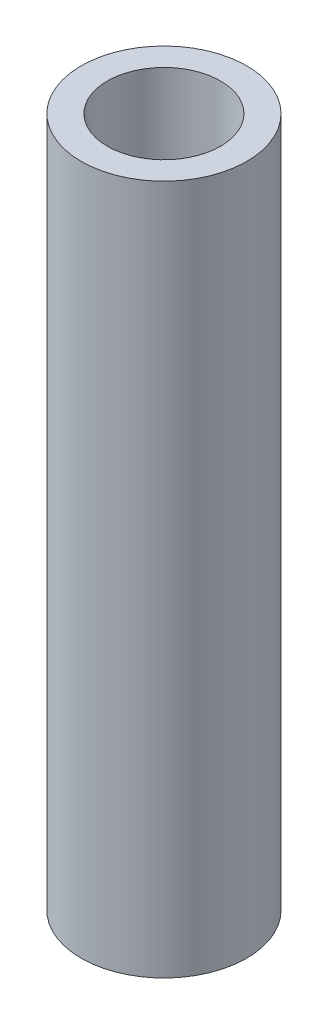
ISO-10303-21;
HEADER;
FILE_DESCRIPTION(('STEP AP214'),'2;1');
FILE_NAME('part.step','',(''),(''),'','','');
FILE_SCHEMA(('AUTOMOTIVE_DESIGN { 1 0 10303 214 1 1 1 1 }'));
ENDSEC;
DATA;
#1=APPLICATION_CONTEXT('core data for automotive mechanical design processes');
#2=APPLICATION_PROTOCOL_DEFINITION('international standard','automotive_design',2000,#1);
#3=PRODUCT_CONTEXT('',#1,'mechanical');
#4=PRODUCT('Part','Part','',(#3));
#5=PRODUCT_RELATED_PRODUCT_CATEGORY('part','',(#4));
#6=PRODUCT_DEFINITION_FORMATION('','',#4);
#7=PRODUCT_DEFINITION_CONTEXT('part definition',#1,'design');
#8=PRODUCT_DEFINITION('design','',#6,#7);
#9=PRODUCT_DEFINITION_SHAPE('','',#8);
#10=(LENGTH_UNIT() NAMED_UNIT(*) SI_UNIT(.MILLI.,.METRE.));
#11=(NAMED_UNIT(*) PLANE_ANGLE_UNIT() SI_UNIT($,.RADIAN.));
#12=(NAMED_UNIT(*) SI_UNIT($,.STERADIAN.) SOLID_ANGLE_UNIT());
#13=UNCERTAINTY_MEASURE_WITH_UNIT(LENGTH_MEASURE(1.E-05),#10,'distance_accuracy_value','');
#14=(GEOMETRIC_REPRESENTATION_CONTEXT(3) GLOBAL_UNCERTAINTY_ASSIGNED_CONTEXT((#13)) GLOBAL_UNIT_ASSIGNED_CONTEXT((#10,
#11,#12)) REPRESENTATION_CONTEXT('',''));
#15=CARTESIAN_POINT('',(0.,0.,0.));
#16=DIRECTION('',(0.,0.,1.));
#17=DIRECTION('',(1.,0.,0.));
#18=AXIS2_PLACEMENT_3D('',#15,#16,#17);
#19=CARTESIAN_POINT('',(0.,50.,0.));
#20=DIRECTION('',(0.,1.,0.));
#21=DIRECTION('',(0.,0.,1.));
#22=AXIS2_PLACEMENT_3D('',#19,#20,#21);
#23=PLANE('',#22);
#24=CARTESIAN_POINT('',(0.,50.,0.));
#25=DIRECTION('',(0.,1.,0.));
#26=DIRECTION('',(0.,0.,1.));
#27=AXIS2_PLACEMENT_3D('',#24,#25,#26);
#28=CIRCLE('',#27,6.);
#29=CARTESIAN_POINT('',(0.,50.,6.));
#30=VERTEX_POINT('',#29);
#31=EDGE_CURVE('E10',#30,#30,#28,.T.);
#32=ORIENTED_EDGE('',*,*,#31,.T.);
#33=EDGE_LOOP('',(#32));
#34=FACE_BOUND('',#33,.T.);
#35=CARTESIAN_POINT('',(0.,50.,0.));
#36=DIRECTION('',(0.,1.,0.));
#37=DIRECTION('',(0.,0.,1.));
#38=AXIS2_PLACEMENT_3D('',#35,#36,#37);
#39=CIRCLE('',#38,4.1);
#40=CARTESIAN_POINT('',(0.,50.,4.1));
#41=VERTEX_POINT('',#40);
#42=EDGE_CURVE('E48',#41,#41,#39,.T.);
#43=ORIENTED_EDGE('',*,*,#42,.F.);
#44=EDGE_LOOP('',(#43));
#45=FACE_BOUND('',#44,.T.);
#46=ADVANCED_FACE('F37',(#34,#45),#23,.T.);
#47=CARTESIAN_POINT('',(0.,0.,0.));
#48=DIRECTION('',(0.,1.,0.));
#49=DIRECTION('',(0.,0.,1.));
#50=AXIS2_PLACEMENT_3D('',#47,#48,#49);
#51=PLANE('',#50);
#52=CARTESIAN_POINT('',(0.,0.,0.));
#53=DIRECTION('',(0.,1.,0.));
#54=DIRECTION('',(0.,0.,1.));
#55=AXIS2_PLACEMENT_3D('',#52,#53,#54);
#56=CIRCLE('',#55,6.);
#57=CARTESIAN_POINT('',(0.,0.,6.));
#58=VERTEX_POINT('',#57);
#59=EDGE_CURVE('E41',#58,#58,#56,.T.);
#60=ORIENTED_EDGE('',*,*,#59,.F.);
#61=EDGE_LOOP('',(#60));
#62=FACE_BOUND('',#61,.T.);
#63=CARTESIAN_POINT('',(0.,0.,0.));
#64=DIRECTION('',(0.,1.,0.));
#65=DIRECTION('',(0.,0.,1.));
#66=AXIS2_PLACEMENT_3D('',#63,#64,#65);
#67=CIRCLE('',#66,4.1);
#68=CARTESIAN_POINT('',(0.,0.,4.1));
#69=VERTEX_POINT('',#68);
#70=EDGE_CURVE('E50',#69,#69,#67,.T.);
#71=ORIENTED_EDGE('',*,*,#70,.T.);
#72=EDGE_LOOP('',(#71));
#73=FACE_BOUND('',#72,.T.);
#74=ADVANCED_FACE('F60',(#62,#73),#51,.F.);
#75=CARTESIAN_POINT('',(0.,50.,0.));
#76=DIRECTION('',(0.,-1.,0.));
#77=DIRECTION('',(0.,0.,-1.));
#78=AXIS2_PLACEMENT_3D('',#75,#76,#77);
#79=CYLINDRICAL_SURFACE('',#78,6.);
#80=ORIENTED_EDGE('',*,*,#31,.F.);
#81=EDGE_LOOP('',(#80));
#82=FACE_BOUND('',#81,.T.);
#83=ORIENTED_EDGE('',*,*,#59,.T.);
#84=EDGE_LOOP('',(#83));
#85=FACE_BOUND('',#84,.T.);
#86=ADVANCED_FACE('F39',(#82,#85),#79,.T.);
#87=CARTESIAN_POINT('',(0.,50.,0.));
#88=DIRECTION('',(0.,-1.,0.));
#89=DIRECTION('',(0.,0.,-1.));
#90=AXIS2_PLACEMENT_3D('',#87,#88,#89);
#91=CYLINDRICAL_SURFACE('',#90,4.1);
#92=ORIENTED_EDGE('',*,*,#42,.T.);
#93=EDGE_LOOP('',(#92));
#94=FACE_BOUND('',#93,.T.);
#95=ORIENTED_EDGE('',*,*,#70,.F.);
#96=EDGE_LOOP('',(#95));
#97=FACE_BOUND('',#96,.T.);
#98=ADVANCED_FACE('F56',(#94,#97),#91,.F.);
#99=CLOSED_SHELL('',(#46,#74,#86,#98));
#100=MANIFOLD_SOLID_BREP('B2',#99);
#101=ADVANCED_BREP_SHAPE_REPRESENTATION('',(#18,#100),#14);
#102=SHAPE_DEFINITION_REPRESENTATION(#9,#101);
ENDSEC;
END-ISO-10303-21;
